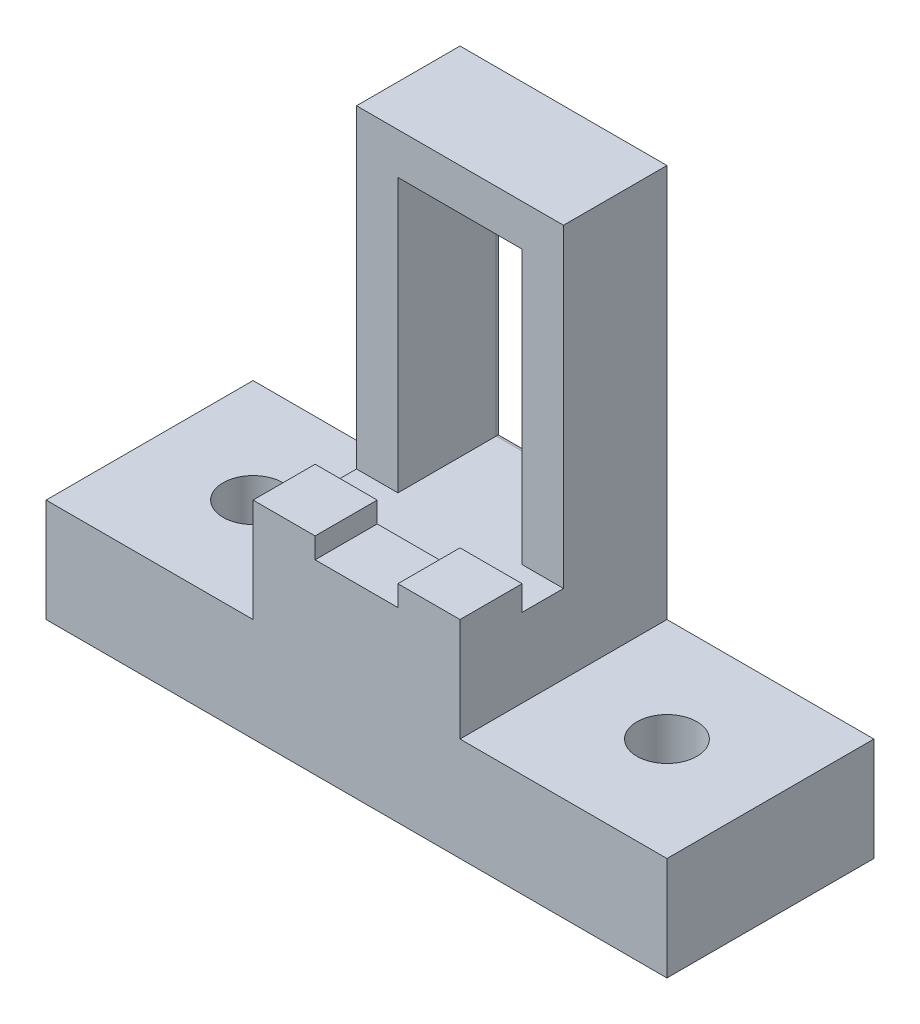
ISO-10303-21;
HEADER;
FILE_DESCRIPTION(('STEP AP214'),'2;1');
FILE_NAME('part.step','',(''),(''),'','','');
FILE_SCHEMA(('AUTOMOTIVE_DESIGN { 1 0 10303 214 1 1 1 1 }'));
ENDSEC;
DATA;
#1=APPLICATION_CONTEXT('core data for automotive mechanical design processes');
#2=APPLICATION_PROTOCOL_DEFINITION('international standard','automotive_design',2000,#1);
#3=PRODUCT_CONTEXT('',#1,'mechanical');
#4=PRODUCT('Part','Part','',(#3));
#5=PRODUCT_RELATED_PRODUCT_CATEGORY('part','',(#4));
#6=PRODUCT_DEFINITION_FORMATION('','',#4);
#7=PRODUCT_DEFINITION_CONTEXT('part definition',#1,'design');
#8=PRODUCT_DEFINITION('design','',#6,#7);
#9=PRODUCT_DEFINITION_SHAPE('','',#8);
#10=(LENGTH_UNIT() NAMED_UNIT(*) SI_UNIT(.MILLI.,.METRE.));
#11=(NAMED_UNIT(*) PLANE_ANGLE_UNIT() SI_UNIT($,.RADIAN.));
#12=(NAMED_UNIT(*) SI_UNIT($,.STERADIAN.) SOLID_ANGLE_UNIT());
#13=UNCERTAINTY_MEASURE_WITH_UNIT(LENGTH_MEASURE(1.E-05),#10,'distance_accuracy_value','');
#14=(GEOMETRIC_REPRESENTATION_CONTEXT(3) GLOBAL_UNCERTAINTY_ASSIGNED_CONTEXT((#13)) GLOBAL_UNIT_ASSIGNED_CONTEXT((#10,
#11,#12)) REPRESENTATION_CONTEXT('',''));
#15=CARTESIAN_POINT('',(0.,0.,0.));
#16=DIRECTION('',(0.,0.,1.));
#17=DIRECTION('',(1.,0.,0.));
#18=AXIS2_PLACEMENT_3D('',#15,#16,#17);
#19=CARTESIAN_POINT('',(-12.,8.8,-0.5));
#20=DIRECTION('',(0.,-1.,0.));
#21=DIRECTION('',(1.,0.,0.));
#22=AXIS2_PLACEMENT_3D('',#19,#20,#21);
#23=PLANE('',#22);
#24=DIRECTION('',(-1.,0.,0.));
#25=VECTOR('',#24,1.);
#26=CARTESIAN_POINT('',(-10.,8.8,-3.));
#27=LINE('',#26,#25);
#28=CARTESIAN_POINT('',(-10.,8.8,-3.));
#29=VERTEX_POINT('',#28);
#30=CARTESIAN_POINT('',(-20.,8.8,-3.));
#31=VERTEX_POINT('',#30);
#32=EDGE_CURVE('E366',#29,#31,#27,.T.);
#33=ORIENTED_EDGE('',*,*,#32,.F.);
#34=DIRECTION('',(0.,0.,-1.));
#35=VECTOR('',#34,1.);
#36=CARTESIAN_POINT('',(-10.,8.8,-5.));
#37=LINE('',#36,#35);
#38=CARTESIAN_POINT('',(-10.,8.8,-5.));
#39=VERTEX_POINT('',#38);
#40=EDGE_CURVE('E308',#29,#39,#37,.T.);
#41=ORIENTED_EDGE('',*,*,#40,.T.);
#42=DIRECTION('',(-1.,0.,0.));
#43=VECTOR('',#42,1.);
#44=CARTESIAN_POINT('',(-20.,8.8,-5.));
#45=LINE('',#44,#43);
#46=CARTESIAN_POINT('',(-12.,8.8,-5.));
#47=VERTEX_POINT('',#46);
#48=EDGE_CURVE('E310',#39,#47,#45,.T.);
#49=ORIENTED_EDGE('',*,*,#48,.T.);
#50=DIRECTION('',(0.,0.,-1.));
#51=VECTOR('',#50,1.);
#52=CARTESIAN_POINT('',(-12.,8.8,-0.5));
#53=LINE('',#52,#51);
#54=CARTESIAN_POINT('',(-12.,8.8,-9.75));
#55=VERTEX_POINT('',#54);
#56=EDGE_CURVE('E328',#47,#55,#53,.T.);
#57=ORIENTED_EDGE('',*,*,#56,.T.);
#58=DIRECTION('',(-1.,0.,0.));
#59=VECTOR('',#58,1.);
#60=CARTESIAN_POINT('',(-12.,8.8,-9.75));
#61=LINE('',#60,#59);
#62=CARTESIAN_POINT('',(-18.,8.8,-9.75));
#63=VERTEX_POINT('',#62);
#64=EDGE_CURVE('E244',#55,#63,#61,.T.);
#65=ORIENTED_EDGE('',*,*,#64,.T.);
#66=DIRECTION('',(0.,0.,-1.));
#67=VECTOR('',#66,1.);
#68=CARTESIAN_POINT('',(-18.,8.8,-0.5));
#69=LINE('',#68,#67);
#70=CARTESIAN_POINT('',(-18.,8.8,-5.));
#71=VERTEX_POINT('',#70);
#72=EDGE_CURVE('E334',#71,#63,#69,.T.);
#73=ORIENTED_EDGE('',*,*,#72,.F.);
#74=DIRECTION('',(1.,0.,0.));
#75=VECTOR('',#74,1.);
#76=CARTESIAN_POINT('',(-20.,8.8,-5.));
#77=LINE('',#76,#75);
#78=CARTESIAN_POINT('',(-20.,8.8,-5.));
#79=VERTEX_POINT('',#78);
#80=EDGE_CURVE('E234',#79,#71,#77,.T.);
#81=ORIENTED_EDGE('',*,*,#80,.F.);
#82=DIRECTION('',(0.,0.,1.));
#83=VECTOR('',#82,1.);
#84=CARTESIAN_POINT('',(-20.,8.8,-5.));
#85=LINE('',#84,#83);
#86=EDGE_CURVE('E306',#79,#31,#85,.T.);
#87=ORIENTED_EDGE('',*,*,#86,.T.);
#88=EDGE_LOOP('',(#33,#41,#49,#57,#65,#73,#81,#87));
#89=FACE_BOUND('',#88,.T.);
#90=ADVANCED_FACE('F34',(#89),#23,.F.);
#91=CARTESIAN_POINT('',(0.,10.,0.));
#92=DIRECTION('',(0.,1.,0.));
#93=DIRECTION('',(0.,0.,1.));
#94=AXIS2_PLACEMENT_3D('',#91,#92,#93);
#95=PLANE('',#94);
#96=DIRECTION('',(0.,0.,-1.));
#97=VECTOR('',#96,1.);
#98=CARTESIAN_POINT('',(-13.,10.,0.));
#99=LINE('',#98,#97);
#100=CARTESIAN_POINT('',(-13.,10.,0.));
#101=VERTEX_POINT('',#100);
#102=CARTESIAN_POINT('',(-13.,10.,-3.));
#103=VERTEX_POINT('',#102);
#104=EDGE_CURVE('E11',#101,#103,#99,.T.);
#105=ORIENTED_EDGE('',*,*,#104,.F.);
#106=DIRECTION('',(1.,0.,0.));
#107=VECTOR('',#106,1.);
#108=CARTESIAN_POINT('',(-20.,10.,0.));
#109=LINE('',#108,#107);
#110=CARTESIAN_POINT('',(-10.,10.,0.));
#111=VERTEX_POINT('',#110);
#112=EDGE_CURVE('E297',#101,#111,#109,.T.);
#113=ORIENTED_EDGE('',*,*,#112,.T.);
#114=DIRECTION('',(0.,0.,-1.));
#115=VECTOR('',#114,1.);
#116=CARTESIAN_POINT('',(-10.,10.,-2.6));
#117=LINE('',#116,#115);
#118=CARTESIAN_POINT('',(-10.,10.,-3.));
#119=VERTEX_POINT('',#118);
#120=EDGE_CURVE('E296',#111,#119,#117,.T.);
#121=ORIENTED_EDGE('',*,*,#120,.T.);
#122=DIRECTION('',(1.,0.,0.));
#123=VECTOR('',#122,1.);
#124=CARTESIAN_POINT('',(-13.,10.,-3.));
#125=LINE('',#124,#123);
#126=EDGE_CURVE('E369',#103,#119,#125,.T.);
#127=ORIENTED_EDGE('',*,*,#126,.F.);
#128=EDGE_LOOP('',(#105,#113,#121,#127));
#129=FACE_BOUND('',#128,.T.);
#130=ADVANCED_FACE('F396',(#129),#95,.T.);
#131=CARTESIAN_POINT('',(-30.,4.,0.));
#132=DIRECTION('',(0.,0.,-1.));
#133=DIRECTION('',(-1.,0.,0.));
#134=AXIS2_PLACEMENT_3D('',#131,#132,#133);
#135=PLANE('',#134);
#136=DIRECTION('',(0.,-1.,0.));
#137=VECTOR('',#136,1.);
#138=CARTESIAN_POINT('',(0.,4.,0.));
#139=LINE('',#138,#137);
#140=CARTESIAN_POINT('',(0.,5.,0.));
#141=VERTEX_POINT('',#140);
#142=CARTESIAN_POINT('',(0.,0.,0.));
#143=VERTEX_POINT('',#142);
#144=EDGE_CURVE('E231',#141,#143,#139,.T.);
#145=ORIENTED_EDGE('',*,*,#144,.F.);
#146=DIRECTION('',(1.,0.,0.));
#147=VECTOR('',#146,1.);
#148=CARTESIAN_POINT('',(-10.,5.,0.));
#149=LINE('',#148,#147);
#150=CARTESIAN_POINT('',(-10.,5.,0.));
#151=VERTEX_POINT('',#150);
#152=EDGE_CURVE('E206',#151,#141,#149,.T.);
#153=ORIENTED_EDGE('',*,*,#152,.F.);
#154=DIRECTION('',(0.,-1.,0.));
#155=VECTOR('',#154,1.);
#156=CARTESIAN_POINT('',(-10.,10.,0.));
#157=LINE('',#156,#155);
#158=EDGE_CURVE('E205',#111,#151,#157,.T.);
#159=ORIENTED_EDGE('',*,*,#158,.F.);
#160=ORIENTED_EDGE('',*,*,#112,.F.);
#161=DIRECTION('',(0.,1.,0.));
#162=VECTOR('',#161,1.);
#163=CARTESIAN_POINT('',(-13.,10.,0.));
#164=LINE('',#163,#162);
#165=CARTESIAN_POINT('',(-13.,9.,0.));
#166=VERTEX_POINT('',#165);
#167=EDGE_CURVE('E293',#166,#101,#164,.T.);
#168=ORIENTED_EDGE('',*,*,#167,.F.);
#169=DIRECTION('',(1.,0.,0.));
#170=VECTOR('',#169,1.);
#171=CARTESIAN_POINT('',(-17.,9.,0.));
#172=LINE('',#171,#170);
#173=CARTESIAN_POINT('',(-17.,9.,0.));
#174=VERTEX_POINT('',#173);
#175=EDGE_CURVE('E292',#174,#166,#172,.T.);
#176=ORIENTED_EDGE('',*,*,#175,.F.);
#177=DIRECTION('',(0.,-1.,0.));
#178=VECTOR('',#177,1.);
#179=CARTESIAN_POINT('',(-17.,10.,0.));
#180=LINE('',#179,#178);
#181=CARTESIAN_POINT('',(-17.,10.,0.));
#182=VERTEX_POINT('',#181);
#183=EDGE_CURVE('E278',#182,#174,#180,.T.);
#184=ORIENTED_EDGE('',*,*,#183,.F.);
#185=CARTESIAN_POINT('',(-20.,10.,0.));
#186=VERTEX_POINT('',#185);
#187=EDGE_CURVE('E288',#186,#182,#109,.T.);
#188=ORIENTED_EDGE('',*,*,#187,.F.);
#189=DIRECTION('',(0.,-1.,0.));
#190=VECTOR('',#189,1.);
#191=CARTESIAN_POINT('',(-20.,10.,0.));
#192=LINE('',#191,#190);
#193=CARTESIAN_POINT('',(-20.,5.,0.));
#194=VERTEX_POINT('',#193);
#195=EDGE_CURVE('E304',#186,#194,#192,.T.);
#196=ORIENTED_EDGE('',*,*,#195,.T.);
#197=DIRECTION('',(1.,0.,0.));
#198=VECTOR('',#197,1.);
#199=CARTESIAN_POINT('',(-30.,5.,0.));
#200=LINE('',#199,#198);
#201=CARTESIAN_POINT('',(-30.,5.,0.));
#202=VERTEX_POINT('',#201);
#203=EDGE_CURVE('E407',#202,#194,#200,.T.);
#204=ORIENTED_EDGE('',*,*,#203,.F.);
#205=DIRECTION('',(0.,-1.,0.));
#206=VECTOR('',#205,1.);
#207=CARTESIAN_POINT('',(-30.,4.,0.));
#208=LINE('',#207,#206);
#209=CARTESIAN_POINT('',(-30.,0.,0.));
#210=VERTEX_POINT('',#209);
#211=EDGE_CURVE('E223',#202,#210,#208,.T.);
#212=ORIENTED_EDGE('',*,*,#211,.T.);
#213=DIRECTION('',(1.,0.,0.));
#214=VECTOR('',#213,1.);
#215=CARTESIAN_POINT('',(-30.,0.,0.));
#216=LINE('',#215,#214);
#217=EDGE_CURVE('E221',#210,#143,#216,.T.);
#218=ORIENTED_EDGE('',*,*,#217,.T.);
#219=EDGE_LOOP('',(#145,#153,#159,#160,#168,#176,#184,#188,#196,#204,#212,#218));
#220=FACE_BOUND('',#219,.T.);
#221=ADVANCED_FACE('F287',(#220),#135,.F.);
#222=CARTESIAN_POINT('',(-20.,4.,0.));
#223=DIRECTION('',(1.,0.,0.));
#224=DIRECTION('',(0.,0.,-1.));
#225=AXIS2_PLACEMENT_3D('',#222,#223,#224);
#226=PLANE('',#225);
#227=DIRECTION('',(0.,-1.,0.));
#228=VECTOR('',#227,1.);
#229=CARTESIAN_POINT('',(-20.,24.,-10.));
#230=LINE('',#229,#228);
#231=CARTESIAN_POINT('',(-20.,24.,-10.));
#232=VERTEX_POINT('',#231);
#233=CARTESIAN_POINT('',(-20.,5.,-10.));
#234=VERTEX_POINT('',#233);
#235=EDGE_CURVE('E54',#232,#234,#230,.T.);
#236=ORIENTED_EDGE('',*,*,#235,.T.);
#237=DIRECTION('',(0.,0.,-1.));
#238=VECTOR('',#237,1.);
#239=CARTESIAN_POINT('',(-20.,5.,0.));
#240=LINE('',#239,#238);
#241=EDGE_CURVE('E49',#194,#234,#240,.T.);
#242=ORIENTED_EDGE('',*,*,#241,.F.);
#243=ORIENTED_EDGE('',*,*,#195,.F.);
#244=DIRECTION('',(0.,0.,1.));
#245=VECTOR('',#244,1.);
#246=CARTESIAN_POINT('',(-20.,10.,-2.6));
#247=LINE('',#246,#245);
#248=CARTESIAN_POINT('',(-20.,10.,-3.));
#249=VERTEX_POINT('',#248);
#250=EDGE_CURVE('E272',#249,#186,#247,.T.);
#251=ORIENTED_EDGE('',*,*,#250,.F.);
#252=DIRECTION('',(0.,1.,0.));
#253=VECTOR('',#252,1.);
#254=CARTESIAN_POINT('',(-20.,8.8,-3.));
#255=LINE('',#254,#253);
#256=EDGE_CURVE('E371',#31,#249,#255,.T.);
#257=ORIENTED_EDGE('',*,*,#256,.F.);
#258=ORIENTED_EDGE('',*,*,#86,.F.);
#259=DIRECTION('',(0.,1.,0.));
#260=VECTOR('',#259,1.);
#261=CARTESIAN_POINT('',(-20.,-7.18033988749895,-5.));
#262=LINE('',#261,#260);
#263=CARTESIAN_POINT('',(-20.,24.,-5.));
#264=VERTEX_POINT('',#263);
#265=EDGE_CURVE('E316',#79,#264,#262,.T.);
#266=ORIENTED_EDGE('',*,*,#265,.T.);
#267=DIRECTION('',(0.,0.,1.));
#268=VECTOR('',#267,1.);
#269=CARTESIAN_POINT('',(-20.,24.,5.00000000000001));
#270=LINE('',#269,#268);
#271=EDGE_CURVE('E242',#232,#264,#270,.T.);
#272=ORIENTED_EDGE('',*,*,#271,.F.);
#273=EDGE_LOOP('',(#236,#242,#243,#251,#257,#258,#266,#272));
#274=FACE_BOUND('',#273,.T.);
#275=ADVANCED_FACE('F348',(#274),#226,.F.);
#276=CARTESIAN_POINT('',(-10.,4.,5.00000000000001));
#277=DIRECTION('',(-1.,0.,0.));
#278=DIRECTION('',(0.,0.,1.));
#279=AXIS2_PLACEMENT_3D('',#276,#277,#278);
#280=PLANE('',#279);
#281=ORIENTED_EDGE('',*,*,#158,.T.);
#282=DIRECTION('',(0.,0.,1.));
#283=VECTOR('',#282,1.);
#284=CARTESIAN_POINT('',(-10.,5.,-10.));
#285=LINE('',#284,#283);
#286=CARTESIAN_POINT('',(-10.,5.,-10.));
#287=VERTEX_POINT('',#286);
#288=EDGE_CURVE('E187',#287,#151,#285,.T.);
#289=ORIENTED_EDGE('',*,*,#288,.F.);
#290=DIRECTION('',(0.,-1.,0.));
#291=VECTOR('',#290,1.);
#292=CARTESIAN_POINT('',(-10.,24.,-10.));
#293=LINE('',#292,#291);
#294=CARTESIAN_POINT('',(-10.,24.,-10.));
#295=VERTEX_POINT('',#294);
#296=EDGE_CURVE('E201',#295,#287,#293,.T.);
#297=ORIENTED_EDGE('',*,*,#296,.F.);
#298=DIRECTION('',(0.,0.,-1.));
#299=VECTOR('',#298,1.);
#300=CARTESIAN_POINT('',(-10.,24.,5.00000000000001));
#301=LINE('',#300,#299);
#302=CARTESIAN_POINT('',(-10.,24.,-5.));
#303=VERTEX_POINT('',#302);
#304=EDGE_CURVE('E341',#303,#295,#301,.T.);
#305=ORIENTED_EDGE('',*,*,#304,.F.);
#306=DIRECTION('',(0.,1.,0.));
#307=VECTOR('',#306,1.);
#308=CARTESIAN_POINT('',(-10.,-7.18033988749895,-5.));
#309=LINE('',#308,#307);
#310=EDGE_CURVE('E315',#39,#303,#309,.T.);
#311=ORIENTED_EDGE('',*,*,#310,.F.);
#312=ORIENTED_EDGE('',*,*,#40,.F.);
#313=DIRECTION('',(0.,-1.,0.));
#314=VECTOR('',#313,1.);
#315=CARTESIAN_POINT('',(-10.,10.,-3.));
#316=LINE('',#315,#314);
#317=EDGE_CURVE('E359',#119,#29,#316,.T.);
#318=ORIENTED_EDGE('',*,*,#317,.F.);
#319=ORIENTED_EDGE('',*,*,#120,.F.);
#320=EDGE_LOOP('',(#281,#289,#297,#305,#311,#312,#318,#319));
#321=FACE_BOUND('',#320,.T.);
#322=ADVANCED_FACE('F199',(#321),#280,.F.);
#323=CARTESIAN_POINT('',(0.,0.,0.));
#324=DIRECTION('',(0.,1.,0.));
#325=DIRECTION('',(0.,0.,1.));
#326=AXIS2_PLACEMENT_3D('',#323,#324,#325);
#327=PLANE('',#326);
#328=CARTESIAN_POINT('',(-5.,0.,-5.));
#329=DIRECTION('',(0.,1.,0.));
#330=DIRECTION('',(0.,0.,1.));
#331=AXIS2_PLACEMENT_3D('',#328,#329,#330);
#332=CIRCLE('',#331,1.45);
#333=CARTESIAN_POINT('',(-5.,0.,-3.55));
#334=VERTEX_POINT('',#333);
#335=EDGE_CURVE('E235',#334,#334,#332,.T.);
#336=ORIENTED_EDGE('',*,*,#335,.T.);
#337=EDGE_LOOP('',(#336));
#338=FACE_BOUND('',#337,.T.);
#339=CARTESIAN_POINT('',(-25.,0.,-5.));
#340=DIRECTION('',(0.,1.,0.));
#341=DIRECTION('',(0.,0.,1.));
#342=AXIS2_PLACEMENT_3D('',#339,#340,#341);
#343=CIRCLE('',#342,1.45);
#344=CARTESIAN_POINT('',(-25.,0.,-3.55));
#345=VERTEX_POINT('',#344);
#346=EDGE_CURVE('E238',#345,#345,#343,.T.);
#347=ORIENTED_EDGE('',*,*,#346,.T.);
#348=EDGE_LOOP('',(#347));
#349=FACE_BOUND('',#348,.T.);
#350=DIRECTION('',(0.,0.,-1.));
#351=VECTOR('',#350,1.);
#352=CARTESIAN_POINT('',(0.,0.,0.));
#353=LINE('',#352,#351);
#354=CARTESIAN_POINT('',(0.,0.,-10.));
#355=VERTEX_POINT('',#354);
#356=EDGE_CURVE('E211',#143,#355,#353,.T.);
#357=ORIENTED_EDGE('',*,*,#356,.F.);
#358=ORIENTED_EDGE('',*,*,#217,.F.);
#359=DIRECTION('',(0.,0.,1.));
#360=VECTOR('',#359,1.);
#361=CARTESIAN_POINT('',(-30.,0.,0.));
#362=LINE('',#361,#360);
#363=CARTESIAN_POINT('',(-30.,0.,-9.99999999999999));
#364=VERTEX_POINT('',#363);
#365=EDGE_CURVE('E219',#364,#210,#362,.T.);
#366=ORIENTED_EDGE('',*,*,#365,.F.);
#367=DIRECTION('',(-1.,0.,0.));
#368=VECTOR('',#367,1.);
#369=CARTESIAN_POINT('',(0.,0.,-10.));
#370=LINE('',#369,#368);
#371=EDGE_CURVE('E213',#355,#364,#370,.T.);
#372=ORIENTED_EDGE('',*,*,#371,.F.);
#373=EDGE_LOOP('',(#357,#358,#366,#372));
#374=FACE_BOUND('',#373,.T.);
#375=ADVANCED_FACE('F419',(#338,#349,#374),#327,.F.);
#376=CARTESIAN_POINT('',(0.,24.,0.));
#377=DIRECTION('',(0.,-1.,0.));
#378=DIRECTION('',(0.,0.,-1.));
#379=AXIS2_PLACEMENT_3D('',#376,#377,#378);
#380=PLANE('',#379);
#381=ORIENTED_EDGE('',*,*,#271,.T.);
#382=DIRECTION('',(-1.,0.,0.));
#383=VECTOR('',#382,1.);
#384=CARTESIAN_POINT('',(-20.,24.,-5.));
#385=LINE('',#384,#383);
#386=EDGE_CURVE('E312',#303,#264,#385,.T.);
#387=ORIENTED_EDGE('',*,*,#386,.F.);
#388=ORIENTED_EDGE('',*,*,#304,.T.);
#389=DIRECTION('',(-1.,0.,0.));
#390=VECTOR('',#389,1.);
#391=CARTESIAN_POINT('',(-20.,24.,-10.));
#392=LINE('',#391,#390);
#393=EDGE_CURVE('E210',#295,#232,#392,.T.);
#394=ORIENTED_EDGE('',*,*,#393,.T.);
#395=EDGE_LOOP('',(#381,#387,#388,#394));
#396=FACE_BOUND('',#395,.T.);
#397=ADVANCED_FACE('F343',(#396),#380,.F.);
#398=CARTESIAN_POINT('',(0.,4.,0.));
#399=DIRECTION('',(-1.,0.,0.));
#400=DIRECTION('',(0.,0.,1.));
#401=AXIS2_PLACEMENT_3D('',#398,#399,#400);
#402=PLANE('',#401);
#403=ORIENTED_EDGE('',*,*,#356,.T.);
#404=DIRECTION('',(0.,-1.,0.));
#405=VECTOR('',#404,1.);
#406=CARTESIAN_POINT('',(0.,4.,-10.));
#407=LINE('',#406,#405);
#408=CARTESIAN_POINT('',(0.,5.,-10.));
#409=VERTEX_POINT('',#408);
#410=EDGE_CURVE('E229',#409,#355,#407,.T.);
#411=ORIENTED_EDGE('',*,*,#410,.F.);
#412=DIRECTION('',(0.,0.,-1.));
#413=VECTOR('',#412,1.);
#414=CARTESIAN_POINT('',(0.,5.,0.));
#415=LINE('',#414,#413);
#416=EDGE_CURVE('E190',#141,#409,#415,.T.);
#417=ORIENTED_EDGE('',*,*,#416,.F.);
#418=ORIENTED_EDGE('',*,*,#144,.T.);
#419=EDGE_LOOP('',(#403,#411,#417,#418));
#420=FACE_BOUND('',#419,.T.);
#421=ADVANCED_FACE('F422',(#420),#402,.F.);
#422=CARTESIAN_POINT('',(0.,4.,-10.));
#423=DIRECTION('',(0.,0.,1.));
#424=DIRECTION('',(1.,0.,0.));
#425=AXIS2_PLACEMENT_3D('',#422,#423,#424);
#426=PLANE('',#425);
#427=DIRECTION('',(0.,-1.,0.));
#428=VECTOR('',#427,1.);
#429=CARTESIAN_POINT('',(-30.,4.,-9.99999999999999));
#430=LINE('',#429,#428);
#431=CARTESIAN_POINT('',(-30.,5.,-9.99999999999999));
#432=VERTEX_POINT('',#431);
#433=EDGE_CURVE('E226',#432,#364,#430,.T.);
#434=ORIENTED_EDGE('',*,*,#433,.F.);
#435=DIRECTION('',(-1.,0.,0.));
#436=VECTOR('',#435,1.);
#437=CARTESIAN_POINT('',(-20.,5.,-10.));
#438=LINE('',#437,#436);
#439=EDGE_CURVE('E347',#234,#432,#438,.T.);
#440=ORIENTED_EDGE('',*,*,#439,.F.);
#441=ORIENTED_EDGE('',*,*,#235,.F.);
#442=ORIENTED_EDGE('',*,*,#393,.F.);
#443=ORIENTED_EDGE('',*,*,#296,.T.);
#444=DIRECTION('',(-1.,0.,0.));
#445=VECTOR('',#444,1.);
#446=CARTESIAN_POINT('',(0.,5.,-10.));
#447=LINE('',#446,#445);
#448=EDGE_CURVE('E182',#409,#287,#447,.T.);
#449=ORIENTED_EDGE('',*,*,#448,.F.);
#450=ORIENTED_EDGE('',*,*,#410,.T.);
#451=ORIENTED_EDGE('',*,*,#371,.T.);
#452=EDGE_LOOP('',(#434,#440,#441,#442,#443,#449,#450,#451));
#453=FACE_BOUND('',#452,.T.);
#454=DIRECTION('',(1.,0.,0.));
#455=VECTOR('',#454,1.);
#456=CARTESIAN_POINT('',(0.,22.25,-10.));
#457=LINE('',#456,#455);
#458=CARTESIAN_POINT('',(-11.75,22.25,-10.));
#459=VERTEX_POINT('',#458);
#460=CARTESIAN_POINT('',(-18.25,22.25,-10.));
#461=VERTEX_POINT('',#460);
#462=EDGE_CURVE('E249',#459,#461,#457,.F.);
#463=ORIENTED_EDGE('',*,*,#462,.T.);
#464=DIRECTION('',(0.,1.,0.));
#465=VECTOR('',#464,1.);
#466=CARTESIAN_POINT('',(-18.25,4.,-10.));
#467=LINE('',#466,#465);
#468=CARTESIAN_POINT('',(-18.25,8.55,-10.));
#469=VERTEX_POINT('',#468);
#470=EDGE_CURVE('E254',#461,#469,#467,.F.);
#471=ORIENTED_EDGE('',*,*,#470,.T.);
#472=DIRECTION('',(-1.,0.,0.));
#473=VECTOR('',#472,1.);
#474=CARTESIAN_POINT('',(0.,8.55,-10.));
#475=LINE('',#474,#473);
#476=CARTESIAN_POINT('',(-11.75,8.55,-10.));
#477=VERTEX_POINT('',#476);
#478=EDGE_CURVE('E251',#469,#477,#475,.F.);
#479=ORIENTED_EDGE('',*,*,#478,.T.);
#480=DIRECTION('',(0.,-1.,0.));
#481=VECTOR('',#480,1.);
#482=CARTESIAN_POINT('',(-11.75,4.,-10.));
#483=LINE('',#482,#481);
#484=EDGE_CURVE('E247',#477,#459,#483,.F.);
#485=ORIENTED_EDGE('',*,*,#484,.T.);
#486=EDGE_LOOP('',(#463,#471,#479,#485));
#487=FACE_BOUND('',#486,.T.);
#488=ADVANCED_FACE('F208',(#453,#487),#426,.F.);
#489=CARTESIAN_POINT('',(-30.,4.,0.));
#490=DIRECTION('',(1.,0.,0.));
#491=DIRECTION('',(0.,0.,-1.));
#492=AXIS2_PLACEMENT_3D('',#489,#490,#491);
#493=PLANE('',#492);
#494=ORIENTED_EDGE('',*,*,#365,.T.);
#495=ORIENTED_EDGE('',*,*,#211,.F.);
#496=DIRECTION('',(0.,0.,1.));
#497=VECTOR('',#496,1.);
#498=CARTESIAN_POINT('',(-30.,5.,-9.99999999999999));
#499=LINE('',#498,#497);
#500=EDGE_CURVE('E404',#432,#202,#499,.T.);
#501=ORIENTED_EDGE('',*,*,#500,.F.);
#502=ORIENTED_EDGE('',*,*,#433,.T.);
#503=EDGE_LOOP('',(#494,#495,#501,#502));
#504=FACE_BOUND('',#503,.T.);
#505=ADVANCED_FACE('F423',(#504),#493,.F.);
#506=CARTESIAN_POINT('',(-5.,-16.,-5.));
#507=DIRECTION('',(0.,1.,0.));
#508=DIRECTION('',(0.,0.,1.));
#509=AXIS2_PLACEMENT_3D('',#506,#507,#508);
#510=CYLINDRICAL_SURFACE('',#509,1.45);
#511=ORIENTED_EDGE('',*,*,#335,.F.);
#512=EDGE_LOOP('',(#511));
#513=FACE_BOUND('',#512,.T.);
#514=CARTESIAN_POINT('',(-5.,5.,-5.));
#515=DIRECTION('',(0.,1.,0.));
#516=DIRECTION('',(0.,0.,1.));
#517=AXIS2_PLACEMENT_3D('',#514,#515,#516);
#518=CIRCLE('',#517,1.45);
#519=CARTESIAN_POINT('',(-5.,5.,-3.55));
#520=VERTEX_POINT('',#519);
#521=EDGE_CURVE('E194',#520,#520,#518,.T.);
#522=ORIENTED_EDGE('',*,*,#521,.T.);
#523=EDGE_LOOP('',(#522));
#524=FACE_BOUND('',#523,.T.);
#525=ADVANCED_FACE('F425',(#513,#524),#510,.F.);
#526=CARTESIAN_POINT('',(-25.,-16.,-5.));
#527=DIRECTION('',(0.,1.,0.));
#528=DIRECTION('',(0.,0.,1.));
#529=AXIS2_PLACEMENT_3D('',#526,#527,#528);
#530=CYLINDRICAL_SURFACE('',#529,1.45);
#531=ORIENTED_EDGE('',*,*,#346,.F.);
#532=EDGE_LOOP('',(#531));
#533=FACE_BOUND('',#532,.T.);
#534=CARTESIAN_POINT('',(-25.,5.,-5.));
#535=DIRECTION('',(0.,1.,0.));
#536=DIRECTION('',(0.,0.,1.));
#537=AXIS2_PLACEMENT_3D('',#534,#535,#536);
#538=CIRCLE('',#537,1.45);
#539=CARTESIAN_POINT('',(-25.,5.,-3.55));
#540=VERTEX_POINT('',#539);
#541=EDGE_CURVE('E399',#540,#540,#538,.T.);
#542=ORIENTED_EDGE('',*,*,#541,.T.);
#543=EDGE_LOOP('',(#542));
#544=FACE_BOUND('',#543,.T.);
#545=ADVANCED_FACE('F431',(#533,#544),#530,.F.);
#546=CARTESIAN_POINT('',(-12.,22.,-0.5));
#547=DIRECTION('',(1.,0.,0.));
#548=DIRECTION('',(0.,1.,0.));
#549=AXIS2_PLACEMENT_3D('',#546,#547,#548);
#550=PLANE('',#549);
#551=DIRECTION('',(0.,0.,-1.));
#552=VECTOR('',#551,1.);
#553=CARTESIAN_POINT('',(-12.,22.,-0.5));
#554=LINE('',#553,#552);
#555=CARTESIAN_POINT('',(-12.,22.,-5.));
#556=VERTEX_POINT('',#555);
#557=CARTESIAN_POINT('',(-12.,22.,-9.75));
#558=VERTEX_POINT('',#557);
#559=EDGE_CURVE('E239',#556,#558,#554,.T.);
#560=ORIENTED_EDGE('',*,*,#559,.T.);
#561=DIRECTION('',(0.,-1.,0.));
#562=VECTOR('',#561,1.);
#563=CARTESIAN_POINT('',(-12.,22.,-9.75));
#564=LINE('',#563,#562);
#565=EDGE_CURVE('E260',#558,#55,#564,.T.);
#566=ORIENTED_EDGE('',*,*,#565,.T.);
#567=ORIENTED_EDGE('',*,*,#56,.F.);
#568=DIRECTION('',(0.,1.,0.));
#569=VECTOR('',#568,1.);
#570=CARTESIAN_POINT('',(-12.,22.,-5.));
#571=LINE('',#570,#569);
#572=EDGE_CURVE('E325',#47,#556,#571,.T.);
#573=ORIENTED_EDGE('',*,*,#572,.T.);
#574=EDGE_LOOP('',(#560,#566,#567,#573));
#575=FACE_BOUND('',#574,.T.);
#576=ADVANCED_FACE('F446',(#575),#550,.F.);
#577=CARTESIAN_POINT('',(-12.,22.,-0.5));
#578=DIRECTION('',(0.,1.,0.));
#579=DIRECTION('',(0.,0.,1.));
#580=AXIS2_PLACEMENT_3D('',#577,#578,#579);
#581=PLANE('',#580);
#582=DIRECTION('',(0.,0.,-1.));
#583=VECTOR('',#582,1.);
#584=CARTESIAN_POINT('',(-18.,22.,-0.5));
#585=LINE('',#584,#583);
#586=CARTESIAN_POINT('',(-18.,22.,-5.));
#587=VERTEX_POINT('',#586);
#588=CARTESIAN_POINT('',(-18.,22.,-9.75));
#589=VERTEX_POINT('',#588);
#590=EDGE_CURVE('E331',#587,#589,#585,.T.);
#591=ORIENTED_EDGE('',*,*,#590,.T.);
#592=DIRECTION('',(1.,0.,0.));
#593=VECTOR('',#592,1.);
#594=CARTESIAN_POINT('',(-12.,22.,-9.75));
#595=LINE('',#594,#593);
#596=EDGE_CURVE('E256',#589,#558,#595,.T.);
#597=ORIENTED_EDGE('',*,*,#596,.T.);
#598=ORIENTED_EDGE('',*,*,#559,.F.);
#599=DIRECTION('',(-1.,0.,0.));
#600=VECTOR('',#599,1.);
#601=CARTESIAN_POINT('',(-12.,22.,-5.));
#602=LINE('',#601,#600);
#603=EDGE_CURVE('E322',#556,#587,#602,.T.);
#604=ORIENTED_EDGE('',*,*,#603,.T.);
#605=EDGE_LOOP('',(#591,#597,#598,#604));
#606=FACE_BOUND('',#605,.T.);
#607=ADVANCED_FACE('F449',(#606),#581,.F.);
#608=CARTESIAN_POINT('',(-18.,22.,-0.5));
#609=DIRECTION('',(-1.,0.,0.));
#610=DIRECTION('',(0.,0.,1.));
#611=AXIS2_PLACEMENT_3D('',#608,#609,#610);
#612=PLANE('',#611);
#613=ORIENTED_EDGE('',*,*,#72,.T.);
#614=DIRECTION('',(0.,1.,0.));
#615=VECTOR('',#614,1.);
#616=CARTESIAN_POINT('',(-18.,22.,-9.75));
#617=LINE('',#616,#615);
#618=EDGE_CURVE('E258',#63,#589,#617,.T.);
#619=ORIENTED_EDGE('',*,*,#618,.T.);
#620=ORIENTED_EDGE('',*,*,#590,.F.);
#621=DIRECTION('',(0.,-1.,0.));
#622=VECTOR('',#621,1.);
#623=CARTESIAN_POINT('',(-18.,22.,-5.));
#624=LINE('',#623,#622);
#625=EDGE_CURVE('E318',#587,#71,#624,.T.);
#626=ORIENTED_EDGE('',*,*,#625,.T.);
#627=EDGE_LOOP('',(#613,#619,#620,#626));
#628=FACE_BOUND('',#627,.T.);
#629=ADVANCED_FACE('F444',(#628),#612,.F.);
#630=CARTESIAN_POINT('',(-20.,-7.18033988749895,-5.));
#631=DIRECTION('',(0.,0.,-1.));
#632=DIRECTION('',(-1.,0.,0.));
#633=AXIS2_PLACEMENT_3D('',#630,#631,#632);
#634=PLANE('',#633);
#635=ORIENTED_EDGE('',*,*,#265,.F.);
#636=ORIENTED_EDGE('',*,*,#80,.T.);
#637=ORIENTED_EDGE('',*,*,#625,.F.);
#638=ORIENTED_EDGE('',*,*,#603,.F.);
#639=ORIENTED_EDGE('',*,*,#572,.F.);
#640=ORIENTED_EDGE('',*,*,#48,.F.);
#641=ORIENTED_EDGE('',*,*,#310,.T.);
#642=ORIENTED_EDGE('',*,*,#386,.T.);
#643=EDGE_LOOP('',(#635,#636,#637,#638,#639,#640,#641,#642));
#644=FACE_BOUND('',#643,.T.);
#645=ADVANCED_FACE('F353',(#644),#634,.F.);
#646=DIRECTION('',(0.,0.,1.));
#647=VECTOR('',#646,1.);
#648=CARTESIAN_POINT('',(-17.,10.,0.));
#649=LINE('',#648,#647);
#650=CARTESIAN_POINT('',(-17.,10.,-3.));
#651=VERTEX_POINT('',#650);
#652=EDGE_CURVE('E42',#651,#182,#649,.T.);
#653=ORIENTED_EDGE('',*,*,#652,.F.);
#654=DIRECTION('',(1.,0.,0.));
#655=VECTOR('',#654,1.);
#656=CARTESIAN_POINT('',(-20.,10.,-3.));
#657=LINE('',#656,#655);
#658=EDGE_CURVE('E378',#249,#651,#657,.T.);
#659=ORIENTED_EDGE('',*,*,#658,.F.);
#660=ORIENTED_EDGE('',*,*,#250,.T.);
#661=ORIENTED_EDGE('',*,*,#187,.T.);
#662=EDGE_LOOP('',(#653,#659,#660,#661));
#663=FACE_BOUND('',#662,.T.);
#664=ADVANCED_FACE('F295',(#663),#95,.T.);
#665=CARTESIAN_POINT('',(-12.,22.25,-9.75));
#666=DIRECTION('',(1.,0.,0.));
#667=DIRECTION('',(0.,0.,-1.));
#668=AXIS2_PLACEMENT_3D('',#665,#666,#667);
#669=CYLINDRICAL_SURFACE('',#668,0.25);
#670=CARTESIAN_POINT('',(-18.25,22.25,-9.75));
#671=DIRECTION('',(0.707106781186547,0.707106781186547,0.));
#672=DIRECTION('',(0.707106781186547,-0.707106781186547,0.));
#673=AXIS2_PLACEMENT_3D('',#670,#671,#672);
#674=ELLIPSE('',#673,0.353553390593274,0.25);
#675=EDGE_CURVE('E267',#461,#589,#674,.F.);
#676=ORIENTED_EDGE('',*,*,#675,.F.);
#677=ORIENTED_EDGE('',*,*,#462,.F.);
#678=CARTESIAN_POINT('',(-11.75,22.25,-9.75));
#679=DIRECTION('',(0.707106781186547,-0.707106781186548,0.));
#680=DIRECTION('',(0.707106781186548,0.707106781186547,0.));
#681=AXIS2_PLACEMENT_3D('',#678,#679,#680);
#682=ELLIPSE('',#681,0.353553390593274,0.25);
#683=EDGE_CURVE('E270',#558,#459,#682,.T.);
#684=ORIENTED_EDGE('',*,*,#683,.F.);
#685=ORIENTED_EDGE('',*,*,#596,.F.);
#686=EDGE_LOOP('',(#676,#677,#684,#685));
#687=FACE_BOUND('',#686,.T.);
#688=ADVANCED_FACE('F36',(#687),#669,.T.);
#689=CARTESIAN_POINT('',(-11.75,22.,-9.75));
#690=DIRECTION('',(0.,-1.,0.));
#691=DIRECTION('',(1.,0.,0.));
#692=AXIS2_PLACEMENT_3D('',#689,#690,#691);
#693=CYLINDRICAL_SURFACE('',#692,0.25);
#694=ORIENTED_EDGE('',*,*,#683,.T.);
#695=ORIENTED_EDGE('',*,*,#484,.F.);
#696=CARTESIAN_POINT('',(-11.75,8.55,-9.75));
#697=DIRECTION('',(-0.707106781186547,-0.707106781186547,0.));
#698=DIRECTION('',(-0.707106781186548,0.707106781186547,0.));
#699=AXIS2_PLACEMENT_3D('',#696,#697,#698);
#700=ELLIPSE('',#699,0.353553390593274,0.25);
#701=EDGE_CURVE('E264',#55,#477,#700,.T.);
#702=ORIENTED_EDGE('',*,*,#701,.F.);
#703=ORIENTED_EDGE('',*,*,#565,.F.);
#704=EDGE_LOOP('',(#694,#695,#702,#703));
#705=FACE_BOUND('',#704,.T.);
#706=ADVANCED_FACE('F573',(#705),#693,.T.);
#707=CARTESIAN_POINT('',(-18.25,22.,-9.75));
#708=DIRECTION('',(0.,1.,0.));
#709=DIRECTION('',(0.,0.,1.));
#710=AXIS2_PLACEMENT_3D('',#707,#708,#709);
#711=CYLINDRICAL_SURFACE('',#710,0.25);
#712=ORIENTED_EDGE('',*,*,#675,.T.);
#713=ORIENTED_EDGE('',*,*,#618,.F.);
#714=CARTESIAN_POINT('',(-18.25,8.55,-9.75));
#715=DIRECTION('',(-0.707106781186548,0.707106781186547,0.));
#716=DIRECTION('',(-0.707106781186547,-0.707106781186548,0.));
#717=AXIS2_PLACEMENT_3D('',#714,#715,#716);
#718=ELLIPSE('',#717,0.353553390593274,0.25);
#719=EDGE_CURVE('E262',#469,#63,#718,.F.);
#720=ORIENTED_EDGE('',*,*,#719,.F.);
#721=ORIENTED_EDGE('',*,*,#470,.F.);
#722=EDGE_LOOP('',(#712,#713,#720,#721));
#723=FACE_BOUND('',#722,.T.);
#724=ADVANCED_FACE('F565',(#723),#711,.T.);
#725=CARTESIAN_POINT('',(-12.,8.55,-9.75));
#726=DIRECTION('',(-1.,0.,0.));
#727=DIRECTION('',(0.,-1.,0.));
#728=AXIS2_PLACEMENT_3D('',#725,#726,#727);
#729=CYLINDRICAL_SURFACE('',#728,0.25);
#730=ORIENTED_EDGE('',*,*,#701,.T.);
#731=ORIENTED_EDGE('',*,*,#478,.F.);
#732=ORIENTED_EDGE('',*,*,#719,.T.);
#733=ORIENTED_EDGE('',*,*,#64,.F.);
#734=EDGE_LOOP('',(#730,#731,#732,#733));
#735=FACE_BOUND('',#734,.T.);
#736=ADVANCED_FACE('F541',(#735),#729,.T.);
#737=CARTESIAN_POINT('',(-17.,9.,-5.2));
#738=DIRECTION('',(0.,-1.,0.));
#739=DIRECTION('',(0.,0.,-1.));
#740=AXIS2_PLACEMENT_3D('',#737,#738,#739);
#741=PLANE('',#740);
#742=DIRECTION('',(0.,0.,1.));
#743=VECTOR('',#742,1.);
#744=CARTESIAN_POINT('',(-17.,9.,-5.2));
#745=LINE('',#744,#743);
#746=CARTESIAN_POINT('',(-17.,9.,-3.));
#747=VERTEX_POINT('',#746);
#748=EDGE_CURVE('E382',#747,#174,#745,.T.);
#749=ORIENTED_EDGE('',*,*,#748,.T.);
#750=ORIENTED_EDGE('',*,*,#175,.T.);
#751=DIRECTION('',(0.,0.,1.));
#752=VECTOR('',#751,1.);
#753=CARTESIAN_POINT('',(-13.,9.,-5.2));
#754=LINE('',#753,#752);
#755=CARTESIAN_POINT('',(-13.,9.,-3.));
#756=VERTEX_POINT('',#755);
#757=EDGE_CURVE('E265',#756,#166,#754,.T.);
#758=ORIENTED_EDGE('',*,*,#757,.F.);
#759=DIRECTION('',(1.,0.,0.));
#760=VECTOR('',#759,1.);
#761=CARTESIAN_POINT('',(-17.,9.,-3.));
#762=LINE('',#761,#760);
#763=EDGE_CURVE('E387',#747,#756,#762,.T.);
#764=ORIENTED_EDGE('',*,*,#763,.F.);
#765=EDGE_LOOP('',(#749,#750,#758,#764));
#766=FACE_BOUND('',#765,.T.);
#767=ADVANCED_FACE('F385',(#766),#741,.F.);
#768=CARTESIAN_POINT('',(-13.,10.,-5.2));
#769=DIRECTION('',(1.,0.,0.));
#770=DIRECTION('',(0.,0.,-1.));
#771=AXIS2_PLACEMENT_3D('',#768,#769,#770);
#772=PLANE('',#771);
#773=ORIENTED_EDGE('',*,*,#757,.T.);
#774=ORIENTED_EDGE('',*,*,#167,.T.);
#775=ORIENTED_EDGE('',*,*,#104,.T.);
#776=DIRECTION('',(0.,1.,0.));
#777=VECTOR('',#776,1.);
#778=CARTESIAN_POINT('',(-13.,9.,-3.));
#779=LINE('',#778,#777);
#780=EDGE_CURVE('E373',#756,#103,#779,.T.);
#781=ORIENTED_EDGE('',*,*,#780,.F.);
#782=EDGE_LOOP('',(#773,#774,#775,#781));
#783=FACE_BOUND('',#782,.T.);
#784=ADVANCED_FACE('F540',(#783),#772,.F.);
#785=CARTESIAN_POINT('',(-17.,10.,-5.2));
#786=DIRECTION('',(-1.,0.,0.));
#787=DIRECTION('',(0.,0.,1.));
#788=AXIS2_PLACEMENT_3D('',#785,#786,#787);
#789=PLANE('',#788);
#790=ORIENTED_EDGE('',*,*,#652,.T.);
#791=ORIENTED_EDGE('',*,*,#183,.T.);
#792=ORIENTED_EDGE('',*,*,#748,.F.);
#793=DIRECTION('',(0.,-1.,0.));
#794=VECTOR('',#793,1.);
#795=CARTESIAN_POINT('',(-17.,10.,-3.));
#796=LINE('',#795,#794);
#797=EDGE_CURVE('E281',#651,#747,#796,.T.);
#798=ORIENTED_EDGE('',*,*,#797,.F.);
#799=EDGE_LOOP('',(#790,#791,#792,#798));
#800=FACE_BOUND('',#799,.T.);
#801=ADVANCED_FACE('F277',(#800),#789,.F.);
#802=CARTESIAN_POINT('',(0.,0.,-3.));
#803=DIRECTION('',(0.,0.,1.));
#804=DIRECTION('',(1.,0.,0.));
#805=AXIS2_PLACEMENT_3D('',#802,#803,#804);
#806=PLANE('',#805);
#807=ORIENTED_EDGE('',*,*,#797,.T.);
#808=ORIENTED_EDGE('',*,*,#763,.T.);
#809=ORIENTED_EDGE('',*,*,#780,.T.);
#810=ORIENTED_EDGE('',*,*,#126,.T.);
#811=ORIENTED_EDGE('',*,*,#317,.T.);
#812=ORIENTED_EDGE('',*,*,#32,.T.);
#813=ORIENTED_EDGE('',*,*,#256,.T.);
#814=ORIENTED_EDGE('',*,*,#658,.T.);
#815=EDGE_LOOP('',(#807,#808,#809,#810,#811,#812,#813,#814));
#816=FACE_BOUND('',#815,.T.);
#817=ADVANCED_FACE('F364',(#816),#806,.F.);
#818=CARTESIAN_POINT('',(0.,5.,0.));
#819=DIRECTION('',(0.,1.,0.));
#820=DIRECTION('',(0.,0.,1.));
#821=AXIS2_PLACEMENT_3D('',#818,#819,#820);
#822=PLANE('',#821);
#823=ORIENTED_EDGE('',*,*,#500,.T.);
#824=ORIENTED_EDGE('',*,*,#203,.T.);
#825=ORIENTED_EDGE('',*,*,#241,.T.);
#826=ORIENTED_EDGE('',*,*,#439,.T.);
#827=EDGE_LOOP('',(#823,#824,#825,#826));
#828=FACE_BOUND('',#827,.T.);
#829=ORIENTED_EDGE('',*,*,#541,.F.);
#830=EDGE_LOOP('',(#829));
#831=FACE_BOUND('',#830,.T.);
#832=ADVANCED_FACE('F410',(#828,#831),#822,.T.);
#833=CARTESIAN_POINT('',(0.,5.,0.));
#834=DIRECTION('',(0.,1.,0.));
#835=DIRECTION('',(0.,0.,1.));
#836=AXIS2_PLACEMENT_3D('',#833,#834,#835);
#837=PLANE('',#836);
#838=ORIENTED_EDGE('',*,*,#448,.T.);
#839=ORIENTED_EDGE('',*,*,#288,.T.);
#840=ORIENTED_EDGE('',*,*,#152,.T.);
#841=ORIENTED_EDGE('',*,*,#416,.T.);
#842=EDGE_LOOP('',(#838,#839,#840,#841));
#843=FACE_BOUND('',#842,.T.);
#844=ORIENTED_EDGE('',*,*,#521,.F.);
#845=EDGE_LOOP('',(#844));
#846=FACE_BOUND('',#845,.T.);
#847=ADVANCED_FACE('F184',(#843,#846),#837,.T.);
#848=CLOSED_SHELL('',(#90,#130,#221,#275,#322,#375,#397,#421,#488,#505,#525,#545,#576,#607,#629,
#645,#664,#688,#706,#724,#736,#767,#784,#801,#817,#832,#847));
#849=MANIFOLD_SOLID_BREP('B2',#848);
#850=ADVANCED_BREP_SHAPE_REPRESENTATION('',(#18,#849),#14);
#851=SHAPE_DEFINITION_REPRESENTATION(#9,#850);
ENDSEC;
END-ISO-10303-21;
